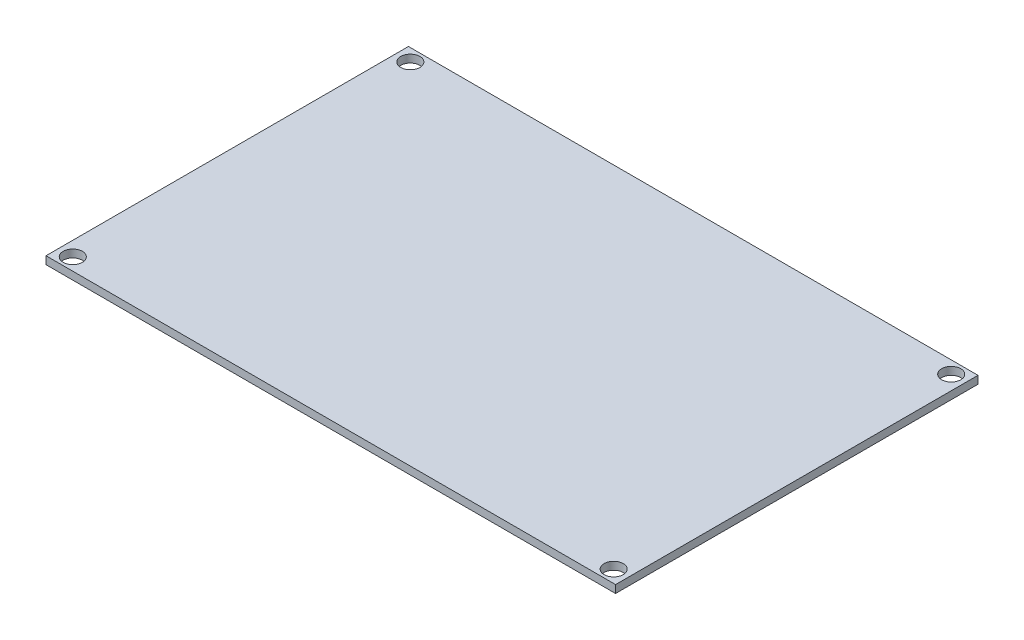
ISO-10303-21;
HEADER;
FILE_DESCRIPTION(('STEP AP214'),'2;1');
FILE_NAME('part.step','',(''),(''),'','','');
FILE_SCHEMA(('AUTOMOTIVE_DESIGN { 1 0 10303 214 1 1 1 1 }'));
ENDSEC;
DATA;
#1=APPLICATION_CONTEXT('core data for automotive mechanical design processes');
#2=APPLICATION_PROTOCOL_DEFINITION('international standard','automotive_design',2000,#1);
#3=PRODUCT_CONTEXT('',#1,'mechanical');
#4=PRODUCT('Part','Part','',(#3));
#5=PRODUCT_RELATED_PRODUCT_CATEGORY('part','',(#4));
#6=PRODUCT_DEFINITION_FORMATION('','',#4);
#7=PRODUCT_DEFINITION_CONTEXT('part definition',#1,'design');
#8=PRODUCT_DEFINITION('design','',#6,#7);
#9=PRODUCT_DEFINITION_SHAPE('','',#8);
#10=(LENGTH_UNIT() NAMED_UNIT(*) SI_UNIT(.MILLI.,.METRE.));
#11=(NAMED_UNIT(*) PLANE_ANGLE_UNIT() SI_UNIT($,.RADIAN.));
#12=(NAMED_UNIT(*) SI_UNIT($,.STERADIAN.) SOLID_ANGLE_UNIT());
#13=UNCERTAINTY_MEASURE_WITH_UNIT(LENGTH_MEASURE(1.E-05),#10,'distance_accuracy_value','');
#14=(GEOMETRIC_REPRESENTATION_CONTEXT(3) GLOBAL_UNCERTAINTY_ASSIGNED_CONTEXT((#13)) GLOBAL_UNIT_ASSIGNED_CONTEXT((#10,
#11,#12)) REPRESENTATION_CONTEXT('',''));
#15=CARTESIAN_POINT('',(0.,0.,0.));
#16=DIRECTION('',(0.,0.,1.));
#17=DIRECTION('',(1.,0.,0.));
#18=AXIS2_PLACEMENT_3D('',#15,#16,#17);
#19=CARTESIAN_POINT('',(55.,1.5,35.));
#20=DIRECTION('',(-1.,0.,0.));
#21=DIRECTION('',(0.,0.,1.));
#22=AXIS2_PLACEMENT_3D('',#19,#20,#21);
#23=PLANE('',#22);
#24=DIRECTION('',(0.,0.,-1.));
#25=VECTOR('',#24,1.);
#26=CARTESIAN_POINT('',(55.,0.,35.));
#27=LINE('',#26,#25);
#28=CARTESIAN_POINT('',(55.,0.,35.));
#29=VERTEX_POINT('',#28);
#30=CARTESIAN_POINT('',(55.,0.,-35.));
#31=VERTEX_POINT('',#30);
#32=EDGE_CURVE('E96',#29,#31,#27,.T.);
#33=ORIENTED_EDGE('',*,*,#32,.T.);
#34=DIRECTION('',(0.,-1.,0.));
#35=VECTOR('',#34,1.);
#36=CARTESIAN_POINT('',(55.,1.5,-35.));
#37=LINE('',#36,#35);
#38=CARTESIAN_POINT('',(55.,1.5,-35.));
#39=VERTEX_POINT('',#38);
#40=EDGE_CURVE('E11',#39,#31,#37,.T.);
#41=ORIENTED_EDGE('',*,*,#40,.F.);
#42=DIRECTION('',(0.,0.,-1.));
#43=VECTOR('',#42,1.);
#44=CARTESIAN_POINT('',(55.,1.5,35.));
#45=LINE('',#44,#43);
#46=CARTESIAN_POINT('',(55.,1.5,35.));
#47=VERTEX_POINT('',#46);
#48=EDGE_CURVE('E84',#47,#39,#45,.T.);
#49=ORIENTED_EDGE('',*,*,#48,.F.);
#50=DIRECTION('',(0.,-1.,0.));
#51=VECTOR('',#50,1.);
#52=CARTESIAN_POINT('',(55.,1.5,35.));
#53=LINE('',#52,#51);
#54=EDGE_CURVE('E92',#47,#29,#53,.T.);
#55=ORIENTED_EDGE('',*,*,#54,.T.);
#56=EDGE_LOOP('',(#33,#41,#49,#55));
#57=FACE_BOUND('',#56,.T.);
#58=ADVANCED_FACE('F33',(#57),#23,.F.);
#59=CARTESIAN_POINT('',(-55.,1.5,-35.));
#60=DIRECTION('',(0.,0.,1.));
#61=DIRECTION('',(1.,0.,0.));
#62=AXIS2_PLACEMENT_3D('',#59,#60,#61);
#63=PLANE('',#62);
#64=DIRECTION('',(-1.,0.,0.));
#65=VECTOR('',#64,1.);
#66=CARTESIAN_POINT('',(-55.,0.,-35.));
#67=LINE('',#66,#65);
#68=CARTESIAN_POINT('',(-55.,0.,-35.));
#69=VERTEX_POINT('',#68);
#70=EDGE_CURVE('E88',#31,#69,#67,.T.);
#71=ORIENTED_EDGE('',*,*,#70,.T.);
#72=DIRECTION('',(0.,-1.,0.));
#73=VECTOR('',#72,1.);
#74=CARTESIAN_POINT('',(-55.,1.5,-35.));
#75=LINE('',#74,#73);
#76=CARTESIAN_POINT('',(-55.,1.5,-35.));
#77=VERTEX_POINT('',#76);
#78=EDGE_CURVE('E41',#77,#69,#75,.T.);
#79=ORIENTED_EDGE('',*,*,#78,.F.);
#80=DIRECTION('',(-1.,0.,0.));
#81=VECTOR('',#80,1.);
#82=CARTESIAN_POINT('',(-55.,1.5,-35.));
#83=LINE('',#82,#81);
#84=EDGE_CURVE('E79',#39,#77,#83,.T.);
#85=ORIENTED_EDGE('',*,*,#84,.F.);
#86=ORIENTED_EDGE('',*,*,#40,.T.);
#87=EDGE_LOOP('',(#71,#79,#85,#86));
#88=FACE_BOUND('',#87,.T.);
#89=ADVANCED_FACE('F87',(#88),#63,.F.);
#90=CARTESIAN_POINT('',(-55.,1.5,35.));
#91=DIRECTION('',(1.,0.,0.));
#92=DIRECTION('',(0.,0.,-1.));
#93=AXIS2_PLACEMENT_3D('',#90,#91,#92);
#94=PLANE('',#93);
#95=DIRECTION('',(0.,0.,1.));
#96=VECTOR('',#95,1.);
#97=CARTESIAN_POINT('',(-55.,0.,35.));
#98=LINE('',#97,#96);
#99=CARTESIAN_POINT('',(-55.,0.,35.));
#100=VERTEX_POINT('',#99);
#101=EDGE_CURVE('E66',#69,#100,#98,.T.);
#102=ORIENTED_EDGE('',*,*,#101,.T.);
#103=DIRECTION('',(0.,-1.,0.));
#104=VECTOR('',#103,1.);
#105=CARTESIAN_POINT('',(-55.,1.5,35.));
#106=LINE('',#105,#104);
#107=CARTESIAN_POINT('',(-55.,1.5,35.));
#108=VERTEX_POINT('',#107);
#109=EDGE_CURVE('E89',#108,#100,#106,.T.);
#110=ORIENTED_EDGE('',*,*,#109,.F.);
#111=DIRECTION('',(0.,0.,1.));
#112=VECTOR('',#111,1.);
#113=CARTESIAN_POINT('',(-55.,1.5,35.));
#114=LINE('',#113,#112);
#115=EDGE_CURVE('E82',#77,#108,#114,.T.);
#116=ORIENTED_EDGE('',*,*,#115,.F.);
#117=ORIENTED_EDGE('',*,*,#78,.T.);
#118=EDGE_LOOP('',(#102,#110,#116,#117));
#119=FACE_BOUND('',#118,.T.);
#120=ADVANCED_FACE('F90',(#119),#94,.F.);
#121=CARTESIAN_POINT('',(-55.,1.5,35.));
#122=DIRECTION('',(0.,0.,-1.));
#123=DIRECTION('',(-1.,0.,0.));
#124=AXIS2_PLACEMENT_3D('',#121,#122,#123);
#125=PLANE('',#124);
#126=DIRECTION('',(1.,0.,0.));
#127=VECTOR('',#126,1.);
#128=CARTESIAN_POINT('',(-55.,0.,35.));
#129=LINE('',#128,#127);
#130=EDGE_CURVE('E72',#100,#29,#129,.T.);
#131=ORIENTED_EDGE('',*,*,#130,.T.);
#132=ORIENTED_EDGE('',*,*,#54,.F.);
#133=DIRECTION('',(1.,0.,0.));
#134=VECTOR('',#133,1.);
#135=CARTESIAN_POINT('',(-55.,1.5,35.));
#136=LINE('',#135,#134);
#137=EDGE_CURVE('E49',#108,#47,#136,.T.);
#138=ORIENTED_EDGE('',*,*,#137,.F.);
#139=ORIENTED_EDGE('',*,*,#109,.T.);
#140=EDGE_LOOP('',(#131,#132,#138,#139));
#141=FACE_BOUND('',#140,.T.);
#142=ADVANCED_FACE('F104',(#141),#125,.F.);
#143=CARTESIAN_POINT('',(0.,1.5,0.));
#144=DIRECTION('',(0.,-1.,0.));
#145=DIRECTION('',(0.,0.,-1.));
#146=AXIS2_PLACEMENT_3D('',#143,#144,#145);
#147=PLANE('',#146);
#148=CARTESIAN_POINT('',(52.2322330484061,1.5,-32.5958694118696));
#149=DIRECTION('',(0.,1.,0.));
#150=DIRECTION('',(0.,0.,-1.));
#151=AXIS2_PLACEMENT_3D('',#148,#149,#150);
#152=CIRCLE('',#151,1.84999999999999);
#153=CARTESIAN_POINT('',(52.2322330484061,1.5,-34.4458694118696));
#154=VERTEX_POINT('',#153);
#155=EDGE_CURVE('E116',#154,#154,#152,.T.);
#156=ORIENTED_EDGE('',*,*,#155,.F.);
#157=EDGE_LOOP('',(#156));
#158=FACE_BOUND('',#157,.T.);
#159=CARTESIAN_POINT('',(-52.232233048406,1.5,32.5958694118692));
#160=DIRECTION('',(0.,1.,0.));
#161=DIRECTION('',(0.,0.,-1.));
#162=AXIS2_PLACEMENT_3D('',#159,#160,#161);
#163=CIRCLE('',#162,1.85);
#164=CARTESIAN_POINT('',(-52.232233048406,1.5,30.7458694118692));
#165=VERTEX_POINT('',#164);
#166=EDGE_CURVE('E122',#165,#165,#163,.T.);
#167=ORIENTED_EDGE('',*,*,#166,.F.);
#168=EDGE_LOOP('',(#167));
#169=FACE_BOUND('',#168,.T.);
#170=CARTESIAN_POINT('',(52.2322330484061,1.5,32.5958694118693));
#171=DIRECTION('',(0.,1.,0.));
#172=DIRECTION('',(0.,0.,1.));
#173=AXIS2_PLACEMENT_3D('',#170,#171,#172);
#174=CIRCLE('',#173,1.84999999999999);
#175=CARTESIAN_POINT('',(52.2322330484061,1.5,34.4458694118693));
#176=VERTEX_POINT('',#175);
#177=EDGE_CURVE('E128',#176,#176,#174,.T.);
#178=ORIENTED_EDGE('',*,*,#177,.F.);
#179=EDGE_LOOP('',(#178));
#180=FACE_BOUND('',#179,.T.);
#181=CARTESIAN_POINT('',(-52.2322330484061,1.5,-32.5958694118692));
#182=DIRECTION('',(0.,1.,0.));
#183=DIRECTION('',(0.,0.,1.));
#184=AXIS2_PLACEMENT_3D('',#181,#182,#183);
#185=CIRCLE('',#184,1.85);
#186=CARTESIAN_POINT('',(-52.2322330484061,1.5,-30.7458694118692));
#187=VERTEX_POINT('',#186);
#188=EDGE_CURVE('E110',#187,#187,#185,.T.);
#189=ORIENTED_EDGE('',*,*,#188,.F.);
#190=EDGE_LOOP('',(#189));
#191=FACE_BOUND('',#190,.T.);
#192=ORIENTED_EDGE('',*,*,#48,.T.);
#193=ORIENTED_EDGE('',*,*,#84,.T.);
#194=ORIENTED_EDGE('',*,*,#115,.T.);
#195=ORIENTED_EDGE('',*,*,#137,.T.);
#196=EDGE_LOOP('',(#192,#193,#194,#195));
#197=FACE_BOUND('',#196,.T.);
#198=ADVANCED_FACE('F80',(#158,#169,#180,#191,#197),#147,.F.);
#199=CARTESIAN_POINT('',(0.,0.,0.));
#200=DIRECTION('',(0.,-1.,0.));
#201=DIRECTION('',(0.,0.,-1.));
#202=AXIS2_PLACEMENT_3D('',#199,#200,#201);
#203=PLANE('',#202);
#204=CARTESIAN_POINT('',(52.2322330484061,0.,-32.5958694118696));
#205=DIRECTION('',(0.,1.,0.));
#206=DIRECTION('',(0.,0.,-1.));
#207=AXIS2_PLACEMENT_3D('',#204,#205,#206);
#208=CIRCLE('',#207,1.84999999999999);
#209=CARTESIAN_POINT('',(52.2322330484061,0.,-34.4458694118696));
#210=VERTEX_POINT('',#209);
#211=EDGE_CURVE('E119',#210,#210,#208,.T.);
#212=ORIENTED_EDGE('',*,*,#211,.T.);
#213=EDGE_LOOP('',(#212));
#214=FACE_BOUND('',#213,.T.);
#215=CARTESIAN_POINT('',(-52.232233048406,0.,32.5958694118692));
#216=DIRECTION('',(0.,1.,0.));
#217=DIRECTION('',(0.,0.,-1.));
#218=AXIS2_PLACEMENT_3D('',#215,#216,#217);
#219=CIRCLE('',#218,1.85);
#220=CARTESIAN_POINT('',(-52.232233048406,0.,30.7458694118692));
#221=VERTEX_POINT('',#220);
#222=EDGE_CURVE('E125',#221,#221,#219,.T.);
#223=ORIENTED_EDGE('',*,*,#222,.T.);
#224=EDGE_LOOP('',(#223));
#225=FACE_BOUND('',#224,.T.);
#226=CARTESIAN_POINT('',(52.2322330484061,0.,32.5958694118693));
#227=DIRECTION('',(0.,1.,0.));
#228=DIRECTION('',(0.,0.,1.));
#229=AXIS2_PLACEMENT_3D('',#226,#227,#228);
#230=CIRCLE('',#229,1.84999999999999);
#231=CARTESIAN_POINT('',(52.2322330484061,0.,34.4458694118693));
#232=VERTEX_POINT('',#231);
#233=EDGE_CURVE('E113',#232,#232,#230,.T.);
#234=ORIENTED_EDGE('',*,*,#233,.T.);
#235=EDGE_LOOP('',(#234));
#236=FACE_BOUND('',#235,.T.);
#237=CARTESIAN_POINT('',(-52.2322330484061,0.,-32.5958694118692));
#238=DIRECTION('',(0.,1.,0.));
#239=DIRECTION('',(0.,0.,1.));
#240=AXIS2_PLACEMENT_3D('',#237,#238,#239);
#241=CIRCLE('',#240,1.85);
#242=CARTESIAN_POINT('',(-52.2322330484061,0.,-30.7458694118692));
#243=VERTEX_POINT('',#242);
#244=EDGE_CURVE('E99',#243,#243,#241,.T.);
#245=ORIENTED_EDGE('',*,*,#244,.T.);
#246=EDGE_LOOP('',(#245));
#247=FACE_BOUND('',#246,.T.);
#248=ORIENTED_EDGE('',*,*,#32,.F.);
#249=ORIENTED_EDGE('',*,*,#130,.F.);
#250=ORIENTED_EDGE('',*,*,#101,.F.);
#251=ORIENTED_EDGE('',*,*,#70,.F.);
#252=EDGE_LOOP('',(#248,#249,#250,#251));
#253=FACE_BOUND('',#252,.T.);
#254=ADVANCED_FACE('F107',(#214,#225,#236,#247,#253),#203,.T.);
#255=CARTESIAN_POINT('',(-52.2322330484061,0.,-32.5958694118692));
#256=DIRECTION('',(0.,1.,0.));
#257=DIRECTION('',(0.,0.,1.));
#258=AXIS2_PLACEMENT_3D('',#255,#256,#257);
#259=CYLINDRICAL_SURFACE('',#258,1.85);
#260=ORIENTED_EDGE('',*,*,#244,.F.);
#261=EDGE_LOOP('',(#260));
#262=FACE_BOUND('',#261,.T.);
#263=ORIENTED_EDGE('',*,*,#188,.T.);
#264=EDGE_LOOP('',(#263));
#265=FACE_BOUND('',#264,.T.);
#266=ADVANCED_FACE('F140',(#262,#265),#259,.F.);
#267=CARTESIAN_POINT('',(52.2322330484061,0.,32.5958694118693));
#268=DIRECTION('',(0.,1.,0.));
#269=DIRECTION('',(0.,0.,1.));
#270=AXIS2_PLACEMENT_3D('',#267,#268,#269);
#271=CYLINDRICAL_SURFACE('',#270,1.84999999999999);
#272=ORIENTED_EDGE('',*,*,#233,.F.);
#273=EDGE_LOOP('',(#272));
#274=FACE_BOUND('',#273,.T.);
#275=ORIENTED_EDGE('',*,*,#177,.T.);
#276=EDGE_LOOP('',(#275));
#277=FACE_BOUND('',#276,.T.);
#278=ADVANCED_FACE('F136',(#274,#277),#271,.F.);
#279=CARTESIAN_POINT('',(-52.232233048406,0.,32.5958694118692));
#280=DIRECTION('',(0.,1.,0.));
#281=DIRECTION('',(0.,0.,1.));
#282=AXIS2_PLACEMENT_3D('',#279,#280,#281);
#283=CYLINDRICAL_SURFACE('',#282,1.85);
#284=ORIENTED_EDGE('',*,*,#222,.F.);
#285=EDGE_LOOP('',(#284));
#286=FACE_BOUND('',#285,.T.);
#287=ORIENTED_EDGE('',*,*,#166,.T.);
#288=EDGE_LOOP('',(#287));
#289=FACE_BOUND('',#288,.T.);
#290=ADVANCED_FACE('F139',(#286,#289),#283,.F.);
#291=CARTESIAN_POINT('',(52.2322330484061,0.,-32.5958694118696));
#292=DIRECTION('',(0.,1.,0.));
#293=DIRECTION('',(0.,0.,1.));
#294=AXIS2_PLACEMENT_3D('',#291,#292,#293);
#295=CYLINDRICAL_SURFACE('',#294,1.84999999999999);
#296=ORIENTED_EDGE('',*,*,#211,.F.);
#297=EDGE_LOOP('',(#296));
#298=FACE_BOUND('',#297,.T.);
#299=ORIENTED_EDGE('',*,*,#155,.T.);
#300=EDGE_LOOP('',(#299));
#301=FACE_BOUND('',#300,.T.);
#302=ADVANCED_FACE('F201',(#298,#301),#295,.F.);
#303=CLOSED_SHELL('',(#58,#89,#120,#142,#198,#254,#266,#278,#290,#302));
#304=MANIFOLD_SOLID_BREP('B2',#303);
#305=ADVANCED_BREP_SHAPE_REPRESENTATION('',(#18,#304),#14);
#306=SHAPE_DEFINITION_REPRESENTATION(#9,#305);
ENDSEC;
END-ISO-10303-21;
